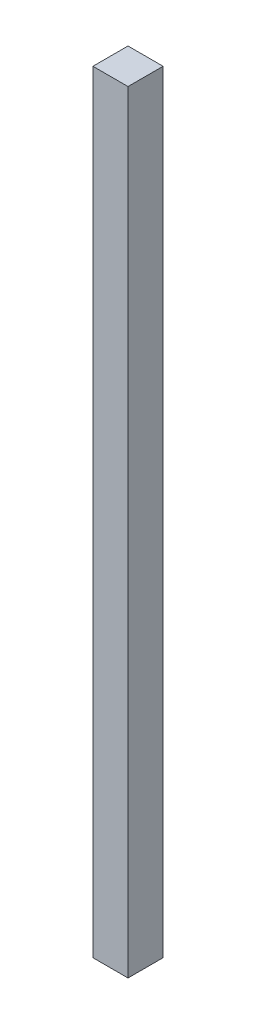
ISO-10303-21;
HEADER;
FILE_DESCRIPTION(('STEP AP214'),'2;1');
FILE_NAME('part.step','',(''),(''),'','','');
FILE_SCHEMA(('AUTOMOTIVE_DESIGN { 1 0 10303 214 1 1 1 1 }'));
ENDSEC;
DATA;
#1=APPLICATION_CONTEXT('core data for automotive mechanical design processes');
#2=APPLICATION_PROTOCOL_DEFINITION('international standard','automotive_design',2000,#1);
#3=PRODUCT_CONTEXT('',#1,'mechanical');
#4=PRODUCT('Part','Part','',(#3));
#5=PRODUCT_RELATED_PRODUCT_CATEGORY('part','',(#4));
#6=PRODUCT_DEFINITION_FORMATION('','',#4);
#7=PRODUCT_DEFINITION_CONTEXT('part definition',#1,'design');
#8=PRODUCT_DEFINITION('design','',#6,#7);
#9=PRODUCT_DEFINITION_SHAPE('','',#8);
#10=(LENGTH_UNIT() NAMED_UNIT(*) SI_UNIT(.MILLI.,.METRE.));
#11=(NAMED_UNIT(*) PLANE_ANGLE_UNIT() SI_UNIT($,.RADIAN.));
#12=(NAMED_UNIT(*) SI_UNIT($,.STERADIAN.) SOLID_ANGLE_UNIT());
#13=UNCERTAINTY_MEASURE_WITH_UNIT(LENGTH_MEASURE(1.E-05),#10,'distance_accuracy_value','');
#14=(GEOMETRIC_REPRESENTATION_CONTEXT(3) GLOBAL_UNCERTAINTY_ASSIGNED_CONTEXT((#13)) GLOBAL_UNIT_ASSIGNED_CONTEXT((#10,
#11,#12)) REPRESENTATION_CONTEXT('',''));
#15=CARTESIAN_POINT('',(0.,0.,0.));
#16=DIRECTION('',(0.,0.,1.));
#17=DIRECTION('',(1.,0.,0.));
#18=AXIS2_PLACEMENT_3D('',#15,#16,#17);
#19=CARTESIAN_POINT('',(50.,2200.,50.));
#20=DIRECTION('',(-1.,0.,0.));
#21=DIRECTION('',(0.,0.,1.));
#22=AXIS2_PLACEMENT_3D('',#19,#20,#21);
#23=PLANE('',#22);
#24=DIRECTION('',(0.,0.,-1.));
#25=VECTOR('',#24,1.);
#26=CARTESIAN_POINT('',(50.,0.,50.));
#27=LINE('',#26,#25);
#28=CARTESIAN_POINT('',(50.,0.,50.));
#29=VERTEX_POINT('',#28);
#30=CARTESIAN_POINT('',(50.,0.,-50.));
#31=VERTEX_POINT('',#30);
#32=EDGE_CURVE('E159',#29,#31,#27,.T.);
#33=ORIENTED_EDGE('',*,*,#32,.T.);
#34=DIRECTION('',(0.,-1.,0.));
#35=VECTOR('',#34,1.);
#36=CARTESIAN_POINT('',(50.,2200.,-50.));
#37=LINE('',#36,#35);
#38=CARTESIAN_POINT('',(50.,2200.,-50.));
#39=VERTEX_POINT('',#38);
#40=EDGE_CURVE('E201',#39,#31,#37,.T.);
#41=ORIENTED_EDGE('',*,*,#40,.F.);
#42=DIRECTION('',(0.,0.,-1.));
#43=VECTOR('',#42,1.);
#44=CARTESIAN_POINT('',(50.,2200.,50.));
#45=LINE('',#44,#43);
#46=CARTESIAN_POINT('',(50.,2200.,50.));
#47=VERTEX_POINT('',#46);
#48=EDGE_CURVE('E164',#47,#39,#45,.T.);
#49=ORIENTED_EDGE('',*,*,#48,.F.);
#50=DIRECTION('',(0.,-1.,0.));
#51=VECTOR('',#50,1.);
#52=CARTESIAN_POINT('',(50.,2200.,50.));
#53=LINE('',#52,#51);
#54=EDGE_CURVE('E178',#47,#29,#53,.T.);
#55=ORIENTED_EDGE('',*,*,#54,.T.);
#56=EDGE_LOOP('',(#33,#41,#49,#55));
#57=FACE_BOUND('',#56,.T.);
#58=ADVANCED_FACE('F39',(#57),#23,.F.);
#59=CARTESIAN_POINT('',(-50.,2200.,-50.));
#60=DIRECTION('',(0.,0.,1.));
#61=DIRECTION('',(1.,0.,0.));
#62=AXIS2_PLACEMENT_3D('',#59,#60,#61);
#63=PLANE('',#62);
#64=DIRECTION('',(0.,1.,0.));
#65=VECTOR('',#64,1.);
#66=CARTESIAN_POINT('',(-25.,350.,-50.));
#67=LINE('',#66,#65);
#68=CARTESIAN_POINT('',(-25.,350.,-50.));
#69=VERTEX_POINT('',#68);
#70=CARTESIAN_POINT('',(-25.0000000000003,1850.,-50.));
#71=VERTEX_POINT('',#70);
#72=EDGE_CURVE('E141',#69,#71,#67,.T.);
#73=ORIENTED_EDGE('',*,*,#72,.F.);
#74=CARTESIAN_POINT('',(-3.67187232424934E-13,350.,-50.));
#75=DIRECTION('',(0.,0.,-1.));
#76=DIRECTION('',(-1.,0.,0.));
#77=AXIS2_PLACEMENT_3D('',#74,#75,#76);
#78=CIRCLE('',#77,25.);
#79=CARTESIAN_POINT('',(25.,350.,-50.));
#80=VERTEX_POINT('',#79);
#81=EDGE_CURVE('E55',#80,#69,#78,.T.);
#82=ORIENTED_EDGE('',*,*,#81,.F.);
#83=DIRECTION('',(0.,-1.,0.));
#84=VECTOR('',#83,1.);
#85=CARTESIAN_POINT('',(25.,350.,-50.));
#86=LINE('',#85,#84);
#87=CARTESIAN_POINT('',(25.0000000000001,1850.,-50.));
#88=VERTEX_POINT('',#87);
#89=EDGE_CURVE('E149',#88,#80,#86,.T.);
#90=ORIENTED_EDGE('',*,*,#89,.F.);
#91=CARTESIAN_POINT('',(-2.75338722488883E-13,1850.,-50.));
#92=DIRECTION('',(0.,0.,-1.));
#93=DIRECTION('',(-1.,0.,0.));
#94=AXIS2_PLACEMENT_3D('',#91,#92,#93);
#95=CIRCLE('',#94,25.);
#96=EDGE_CURVE('E131',#71,#88,#95,.T.);
#97=ORIENTED_EDGE('',*,*,#96,.F.);
#98=EDGE_LOOP('',(#73,#82,#90,#97));
#99=FACE_BOUND('',#98,.T.);
#100=DIRECTION('',(-1.,0.,0.));
#101=VECTOR('',#100,1.);
#102=CARTESIAN_POINT('',(-50.,0.,-50.));
#103=LINE('',#102,#101);
#104=CARTESIAN_POINT('',(-50.,0.,-50.));
#105=VERTEX_POINT('',#104);
#106=EDGE_CURVE('E182',#31,#105,#103,.T.);
#107=ORIENTED_EDGE('',*,*,#106,.T.);
#108=DIRECTION('',(0.,-1.,0.));
#109=VECTOR('',#108,1.);
#110=CARTESIAN_POINT('',(-50.,2200.,-50.));
#111=LINE('',#110,#109);
#112=CARTESIAN_POINT('',(-50.,2200.,-50.));
#113=VERTEX_POINT('',#112);
#114=EDGE_CURVE('E197',#113,#105,#111,.T.);
#115=ORIENTED_EDGE('',*,*,#114,.F.);
#116=DIRECTION('',(-1.,0.,0.));
#117=VECTOR('',#116,1.);
#118=CARTESIAN_POINT('',(-50.,2200.,-50.));
#119=LINE('',#118,#117);
#120=EDGE_CURVE('E168',#39,#113,#119,.T.);
#121=ORIENTED_EDGE('',*,*,#120,.F.);
#122=ORIENTED_EDGE('',*,*,#40,.T.);
#123=EDGE_LOOP('',(#107,#115,#121,#122));
#124=FACE_BOUND('',#123,.T.);
#125=ADVANCED_FACE('F146',(#99,#124),#63,.F.);
#126=CARTESIAN_POINT('',(-50.,2200.,50.));
#127=DIRECTION('',(1.,0.,0.));
#128=DIRECTION('',(0.,0.,-1.));
#129=AXIS2_PLACEMENT_3D('',#126,#127,#128);
#130=PLANE('',#129);
#131=DIRECTION('',(0.,0.,1.));
#132=VECTOR('',#131,1.);
#133=CARTESIAN_POINT('',(-50.,0.,50.));
#134=LINE('',#133,#132);
#135=CARTESIAN_POINT('',(-50.,0.,50.));
#136=VERTEX_POINT('',#135);
#137=EDGE_CURVE('E185',#105,#136,#134,.T.);
#138=ORIENTED_EDGE('',*,*,#137,.T.);
#139=DIRECTION('',(0.,-1.,0.));
#140=VECTOR('',#139,1.);
#141=CARTESIAN_POINT('',(-50.,2200.,50.));
#142=LINE('',#141,#140);
#143=CARTESIAN_POINT('',(-50.,2200.,50.));
#144=VERTEX_POINT('',#143);
#145=EDGE_CURVE('E193',#144,#136,#142,.T.);
#146=ORIENTED_EDGE('',*,*,#145,.F.);
#147=DIRECTION('',(0.,0.,1.));
#148=VECTOR('',#147,1.);
#149=CARTESIAN_POINT('',(-50.,2200.,50.));
#150=LINE('',#149,#148);
#151=EDGE_CURVE('E172',#113,#144,#150,.T.);
#152=ORIENTED_EDGE('',*,*,#151,.F.);
#153=ORIENTED_EDGE('',*,*,#114,.T.);
#154=EDGE_LOOP('',(#138,#146,#152,#153));
#155=FACE_BOUND('',#154,.T.);
#156=ADVANCED_FACE('F281',(#155),#130,.F.);
#157=CARTESIAN_POINT('',(-50.,2200.,50.));
#158=DIRECTION('',(0.,0.,-1.));
#159=DIRECTION('',(-1.,0.,0.));
#160=AXIS2_PLACEMENT_3D('',#157,#158,#159);
#161=PLANE('',#160);
#162=DIRECTION('',(1.,0.,0.));
#163=VECTOR('',#162,1.);
#164=CARTESIAN_POINT('',(-50.,0.,50.));
#165=LINE('',#164,#163);
#166=EDGE_CURVE('E169',#136,#29,#165,.T.);
#167=ORIENTED_EDGE('',*,*,#166,.T.);
#168=ORIENTED_EDGE('',*,*,#54,.F.);
#169=DIRECTION('',(1.,0.,0.));
#170=VECTOR('',#169,1.);
#171=CARTESIAN_POINT('',(-50.,2200.,50.));
#172=LINE('',#171,#170);
#173=EDGE_CURVE('E175',#144,#47,#172,.T.);
#174=ORIENTED_EDGE('',*,*,#173,.F.);
#175=ORIENTED_EDGE('',*,*,#145,.T.);
#176=EDGE_LOOP('',(#167,#168,#174,#175));
#177=FACE_BOUND('',#176,.T.);
#178=ADVANCED_FACE('F394',(#177),#161,.F.);
#179=CARTESIAN_POINT('',(0.,2200.,0.));
#180=DIRECTION('',(0.,-1.,0.));
#181=DIRECTION('',(0.,0.,-1.));
#182=AXIS2_PLACEMENT_3D('',#179,#180,#181);
#183=PLANE('',#182);
#184=ORIENTED_EDGE('',*,*,#48,.T.);
#185=ORIENTED_EDGE('',*,*,#120,.T.);
#186=ORIENTED_EDGE('',*,*,#151,.T.);
#187=ORIENTED_EDGE('',*,*,#173,.T.);
#188=EDGE_LOOP('',(#184,#185,#186,#187));
#189=FACE_BOUND('',#188,.T.);
#190=ADVANCED_FACE('F270',(#189),#183,.F.);
#191=CARTESIAN_POINT('',(0.,0.,0.));
#192=DIRECTION('',(0.,-1.,0.));
#193=DIRECTION('',(0.,0.,-1.));
#194=AXIS2_PLACEMENT_3D('',#191,#192,#193);
#195=PLANE('',#194);
#196=ORIENTED_EDGE('',*,*,#32,.F.);
#197=ORIENTED_EDGE('',*,*,#166,.F.);
#198=ORIENTED_EDGE('',*,*,#137,.F.);
#199=ORIENTED_EDGE('',*,*,#106,.F.);
#200=EDGE_LOOP('',(#196,#197,#198,#199));
#201=FACE_BOUND('',#200,.T.);
#202=ADVANCED_FACE('F263',(#201),#195,.T.);
#203=CARTESIAN_POINT('',(-3.67187232424934E-13,350.,-40.));
#204=DIRECTION('',(0.,0.,-1.));
#205=DIRECTION('',(-1.,0.,0.));
#206=AXIS2_PLACEMENT_3D('',#203,#204,#205);
#207=CYLINDRICAL_SURFACE('',#206,25.);
#208=CARTESIAN_POINT('',(-3.67187232424934E-13,350.,-47.));
#209=DIRECTION('',(0.,0.,1.));
#210=DIRECTION('',(1.,0.,0.));
#211=AXIS2_PLACEMENT_3D('',#208,#209,#210);
#212=CIRCLE('',#211,25.);
#213=CARTESIAN_POINT('',(-25.,350.,-47.));
#214=VERTEX_POINT('',#213);
#215=CARTESIAN_POINT('',(25.,350.,-47.));
#216=VERTEX_POINT('',#215);
#217=EDGE_CURVE('E11',#214,#216,#212,.T.);
#218=ORIENTED_EDGE('',*,*,#217,.T.);
#219=DIRECTION('',(0.,0.,-1.));
#220=VECTOR('',#219,1.);
#221=CARTESIAN_POINT('',(25.,350.,-40.));
#222=LINE('',#221,#220);
#223=EDGE_CURVE('E156',#216,#80,#222,.T.);
#224=ORIENTED_EDGE('',*,*,#223,.T.);
#225=ORIENTED_EDGE('',*,*,#81,.T.);
#226=DIRECTION('',(0.,0.,-1.));
#227=VECTOR('',#226,1.);
#228=CARTESIAN_POINT('',(-25.,350.,-40.));
#229=LINE('',#228,#227);
#230=EDGE_CURVE('E138',#214,#69,#229,.T.);
#231=ORIENTED_EDGE('',*,*,#230,.F.);
#232=EDGE_LOOP('',(#218,#224,#225,#231));
#233=FACE_BOUND('',#232,.T.);
#234=ADVANCED_FACE('F260',(#233),#207,.F.);
#235=CARTESIAN_POINT('',(25.,350.,-40.));
#236=DIRECTION('',(1.,0.,0.));
#237=DIRECTION('',(0.,1.,0.));
#238=AXIS2_PLACEMENT_3D('',#235,#236,#237);
#239=PLANE('',#238);
#240=DIRECTION('',(0.,1.,0.));
#241=VECTOR('',#240,1.);
#242=CARTESIAN_POINT('',(25.0000000000001,2200.,-47.));
#243=LINE('',#242,#241);
#244=CARTESIAN_POINT('',(25.0000000000001,1850.,-47.));
#245=VERTEX_POINT('',#244);
#246=EDGE_CURVE('E48',#216,#245,#243,.T.);
#247=ORIENTED_EDGE('',*,*,#246,.T.);
#248=DIRECTION('',(0.,0.,-1.));
#249=VECTOR('',#248,1.);
#250=CARTESIAN_POINT('',(25.0000000000001,1850.,-40.));
#251=LINE('',#250,#249);
#252=EDGE_CURVE('E137',#245,#88,#251,.T.);
#253=ORIENTED_EDGE('',*,*,#252,.T.);
#254=ORIENTED_EDGE('',*,*,#89,.T.);
#255=ORIENTED_EDGE('',*,*,#223,.F.);
#256=EDGE_LOOP('',(#247,#253,#254,#255));
#257=FACE_BOUND('',#256,.T.);
#258=ADVANCED_FACE('F255',(#257),#239,.F.);
#259=CARTESIAN_POINT('',(-2.75338722488883E-13,1850.,-40.));
#260=DIRECTION('',(0.,0.,-1.));
#261=DIRECTION('',(-1.,0.,0.));
#262=AXIS2_PLACEMENT_3D('',#259,#260,#261);
#263=CYLINDRICAL_SURFACE('',#262,25.);
#264=CARTESIAN_POINT('',(-2.75338722488883E-13,1850.,-47.));
#265=DIRECTION('',(0.,0.,1.));
#266=DIRECTION('',(1.,0.,0.));
#267=AXIS2_PLACEMENT_3D('',#264,#265,#266);
#268=CIRCLE('',#267,25.);
#269=CARTESIAN_POINT('',(-24.9999999999999,1850.,-47.));
#270=VERTEX_POINT('',#269);
#271=EDGE_CURVE('E134',#245,#270,#268,.T.);
#272=ORIENTED_EDGE('',*,*,#271,.T.);
#273=DIRECTION('',(0.,0.,-1.));
#274=VECTOR('',#273,1.);
#275=CARTESIAN_POINT('',(-25.0000000000003,1850.,-40.));
#276=LINE('',#275,#274);
#277=EDGE_CURVE('E63',#270,#71,#276,.T.);
#278=ORIENTED_EDGE('',*,*,#277,.T.);
#279=ORIENTED_EDGE('',*,*,#96,.T.);
#280=ORIENTED_EDGE('',*,*,#252,.F.);
#281=EDGE_LOOP('',(#272,#278,#279,#280));
#282=FACE_BOUND('',#281,.T.);
#283=ADVANCED_FACE('F128',(#282),#263,.F.);
#284=CARTESIAN_POINT('',(-25.,350.,-40.));
#285=DIRECTION('',(-1.,0.,0.));
#286=DIRECTION('',(0.,-1.,0.));
#287=AXIS2_PLACEMENT_3D('',#284,#285,#286);
#288=PLANE('',#287);
#289=DIRECTION('',(0.,-1.,0.));
#290=VECTOR('',#289,1.);
#291=CARTESIAN_POINT('',(-24.9999999999999,2200.,-47.));
#292=LINE('',#291,#290);
#293=EDGE_CURVE('E209',#270,#214,#292,.T.);
#294=ORIENTED_EDGE('',*,*,#293,.T.);
#295=ORIENTED_EDGE('',*,*,#230,.T.);
#296=ORIENTED_EDGE('',*,*,#72,.T.);
#297=ORIENTED_EDGE('',*,*,#277,.F.);
#298=EDGE_LOOP('',(#294,#295,#296,#297));
#299=FACE_BOUND('',#298,.T.);
#300=ADVANCED_FACE('F142',(#299),#288,.F.);
#301=CARTESIAN_POINT('',(47.,2200.,50.));
#302=DIRECTION('',(-1.,0.,0.));
#303=DIRECTION('',(0.,0.,1.));
#304=AXIS2_PLACEMENT_3D('',#301,#302,#303);
#305=PLANE('',#304);
#306=DIRECTION('',(0.,0.,-1.));
#307=VECTOR('',#306,1.);
#308=CARTESIAN_POINT('',(47.,3.,0.));
#309=LINE('',#308,#307);
#310=CARTESIAN_POINT('',(47.,3.,47.));
#311=VERTEX_POINT('',#310);
#312=CARTESIAN_POINT('',(47.,3.,-47.));
#313=VERTEX_POINT('',#312);
#314=EDGE_CURVE('E205',#311,#313,#309,.T.);
#315=ORIENTED_EDGE('',*,*,#314,.F.);
#316=DIRECTION('',(0.,-1.,0.));
#317=VECTOR('',#316,1.);
#318=CARTESIAN_POINT('',(47.,2200.,47.));
#319=LINE('',#318,#317);
#320=CARTESIAN_POINT('',(47.,2197.,47.));
#321=VERTEX_POINT('',#320);
#322=EDGE_CURVE('E241',#321,#311,#319,.T.);
#323=ORIENTED_EDGE('',*,*,#322,.F.);
#324=DIRECTION('',(0.,0.,-1.));
#325=VECTOR('',#324,1.);
#326=CARTESIAN_POINT('',(47.,2197.,0.));
#327=LINE('',#326,#325);
#328=CARTESIAN_POINT('',(47.,2197.,-47.));
#329=VERTEX_POINT('',#328);
#330=EDGE_CURVE('E216',#321,#329,#327,.T.);
#331=ORIENTED_EDGE('',*,*,#330,.T.);
#332=DIRECTION('',(0.,-1.,0.));
#333=VECTOR('',#332,1.);
#334=CARTESIAN_POINT('',(47.,2200.,-47.));
#335=LINE('',#334,#333);
#336=EDGE_CURVE('E234',#329,#313,#335,.T.);
#337=ORIENTED_EDGE('',*,*,#336,.T.);
#338=EDGE_LOOP('',(#315,#323,#331,#337));
#339=FACE_BOUND('',#338,.T.);
#340=ADVANCED_FACE('F285',(#339),#305,.T.);
#341=CARTESIAN_POINT('',(-50.,2200.,-47.));
#342=DIRECTION('',(0.,0.,1.));
#343=DIRECTION('',(1.,0.,0.));
#344=AXIS2_PLACEMENT_3D('',#341,#342,#343);
#345=PLANE('',#344);
#346=ORIENTED_EDGE('',*,*,#217,.F.);
#347=ORIENTED_EDGE('',*,*,#293,.F.);
#348=ORIENTED_EDGE('',*,*,#271,.F.);
#349=ORIENTED_EDGE('',*,*,#246,.F.);
#350=EDGE_LOOP('',(#346,#347,#348,#349));
#351=FACE_BOUND('',#350,.T.);
#352=DIRECTION('',(-1.,0.,0.));
#353=VECTOR('',#352,1.);
#354=CARTESIAN_POINT('',(0.,3.,-47.));
#355=LINE('',#354,#353);
#356=CARTESIAN_POINT('',(-47.,3.,-47.));
#357=VERTEX_POINT('',#356);
#358=EDGE_CURVE('E238',#313,#357,#355,.T.);
#359=ORIENTED_EDGE('',*,*,#358,.F.);
#360=ORIENTED_EDGE('',*,*,#336,.F.);
#361=DIRECTION('',(-1.,0.,0.));
#362=VECTOR('',#361,1.);
#363=CARTESIAN_POINT('',(0.,2197.,-47.));
#364=LINE('',#363,#362);
#365=CARTESIAN_POINT('',(-47.,2197.,-47.));
#366=VERTEX_POINT('',#365);
#367=EDGE_CURVE('E213',#329,#366,#364,.T.);
#368=ORIENTED_EDGE('',*,*,#367,.T.);
#369=DIRECTION('',(0.,-1.,0.));
#370=VECTOR('',#369,1.);
#371=CARTESIAN_POINT('',(-47.,2200.,-47.));
#372=LINE('',#371,#370);
#373=EDGE_CURVE('E227',#366,#357,#372,.T.);
#374=ORIENTED_EDGE('',*,*,#373,.T.);
#375=EDGE_LOOP('',(#359,#360,#368,#374));
#376=FACE_BOUND('',#375,.T.);
#377=ADVANCED_FACE('F258',(#351,#376),#345,.T.);
#378=CARTESIAN_POINT('',(-47.,2200.,50.));
#379=DIRECTION('',(1.,0.,0.));
#380=DIRECTION('',(0.,0.,-1.));
#381=AXIS2_PLACEMENT_3D('',#378,#379,#380);
#382=PLANE('',#381);
#383=DIRECTION('',(0.,0.,1.));
#384=VECTOR('',#383,1.);
#385=CARTESIAN_POINT('',(-47.,3.,0.));
#386=LINE('',#385,#384);
#387=CARTESIAN_POINT('',(-47.,3.,47.));
#388=VERTEX_POINT('',#387);
#389=EDGE_CURVE('E231',#357,#388,#386,.T.);
#390=ORIENTED_EDGE('',*,*,#389,.F.);
#391=ORIENTED_EDGE('',*,*,#373,.F.);
#392=DIRECTION('',(0.,0.,1.));
#393=VECTOR('',#392,1.);
#394=CARTESIAN_POINT('',(-47.,2197.,0.));
#395=LINE('',#394,#393);
#396=CARTESIAN_POINT('',(-47.,2197.,47.));
#397=VERTEX_POINT('',#396);
#398=EDGE_CURVE('E210',#366,#397,#395,.T.);
#399=ORIENTED_EDGE('',*,*,#398,.T.);
#400=DIRECTION('',(0.,-1.,0.));
#401=VECTOR('',#400,1.);
#402=CARTESIAN_POINT('',(-47.,2200.,47.));
#403=LINE('',#402,#401);
#404=EDGE_CURVE('E220',#397,#388,#403,.T.);
#405=ORIENTED_EDGE('',*,*,#404,.T.);
#406=EDGE_LOOP('',(#390,#391,#399,#405));
#407=FACE_BOUND('',#406,.T.);
#408=ADVANCED_FACE('F291',(#407),#382,.T.);
#409=CARTESIAN_POINT('',(-50.,2200.,47.));
#410=DIRECTION('',(0.,0.,-1.));
#411=DIRECTION('',(-1.,0.,0.));
#412=AXIS2_PLACEMENT_3D('',#409,#410,#411);
#413=PLANE('',#412);
#414=DIRECTION('',(1.,0.,0.));
#415=VECTOR('',#414,1.);
#416=CARTESIAN_POINT('',(0.,3.,47.));
#417=LINE('',#416,#415);
#418=EDGE_CURVE('E224',#388,#311,#417,.T.);
#419=ORIENTED_EDGE('',*,*,#418,.F.);
#420=ORIENTED_EDGE('',*,*,#404,.F.);
#421=DIRECTION('',(1.,0.,0.));
#422=VECTOR('',#421,1.);
#423=CARTESIAN_POINT('',(0.,2197.,47.));
#424=LINE('',#423,#422);
#425=EDGE_CURVE('E206',#397,#321,#424,.T.);
#426=ORIENTED_EDGE('',*,*,#425,.T.);
#427=ORIENTED_EDGE('',*,*,#322,.T.);
#428=EDGE_LOOP('',(#419,#420,#426,#427));
#429=FACE_BOUND('',#428,.T.);
#430=ADVANCED_FACE('F294',(#429),#413,.T.);
#431=CARTESIAN_POINT('',(0.,2197.,0.));
#432=DIRECTION('',(0.,-1.,0.));
#433=DIRECTION('',(0.,0.,-1.));
#434=AXIS2_PLACEMENT_3D('',#431,#432,#433);
#435=PLANE('',#434);
#436=ORIENTED_EDGE('',*,*,#330,.F.);
#437=ORIENTED_EDGE('',*,*,#425,.F.);
#438=ORIENTED_EDGE('',*,*,#398,.F.);
#439=ORIENTED_EDGE('',*,*,#367,.F.);
#440=EDGE_LOOP('',(#436,#437,#438,#439));
#441=FACE_BOUND('',#440,.T.);
#442=ADVANCED_FACE('F297',(#441),#435,.T.);
#443=CARTESIAN_POINT('',(0.,3.,0.));
#444=DIRECTION('',(0.,-1.,0.));
#445=DIRECTION('',(0.,0.,-1.));
#446=AXIS2_PLACEMENT_3D('',#443,#444,#445);
#447=PLANE('',#446);
#448=ORIENTED_EDGE('',*,*,#314,.T.);
#449=ORIENTED_EDGE('',*,*,#358,.T.);
#450=ORIENTED_EDGE('',*,*,#389,.T.);
#451=ORIENTED_EDGE('',*,*,#418,.T.);
#452=EDGE_LOOP('',(#448,#449,#450,#451));
#453=FACE_BOUND('',#452,.T.);
#454=ADVANCED_FACE('F41',(#453),#447,.F.);
#455=CLOSED_SHELL('',(#58,#125,#156,#178,#190,#202,#234,#258,#283,#300,#340,#377,#408,#430,#442,#454));
#456=MANIFOLD_SOLID_BREP('B2',#455);
#457=ADVANCED_BREP_SHAPE_REPRESENTATION('',(#18,#456),#14);
#458=SHAPE_DEFINITION_REPRESENTATION(#9,#457);
ENDSEC;
END-ISO-10303-21;
